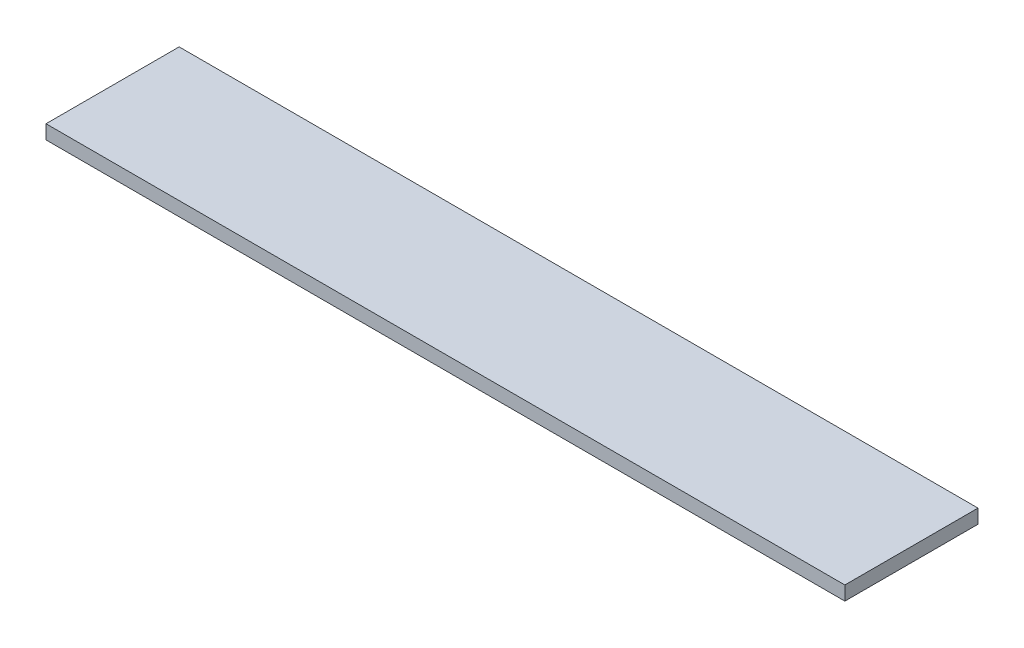
ISO-10303-21;
HEADER;
FILE_DESCRIPTION(('STEP AP214'),'2;1');
FILE_NAME('part.step','',(''),(''),'','','');
FILE_SCHEMA(('AUTOMOTIVE_DESIGN { 1 0 10303 214 1 1 1 1 }'));
ENDSEC;
DATA;
#1=APPLICATION_CONTEXT('core data for automotive mechanical design processes');
#2=APPLICATION_PROTOCOL_DEFINITION('international standard','automotive_design',2000,#1);
#3=PRODUCT_CONTEXT('',#1,'mechanical');
#4=PRODUCT('Part','Part','',(#3));
#5=PRODUCT_RELATED_PRODUCT_CATEGORY('part','',(#4));
#6=PRODUCT_DEFINITION_FORMATION('','',#4);
#7=PRODUCT_DEFINITION_CONTEXT('part definition',#1,'design');
#8=PRODUCT_DEFINITION('design','',#6,#7);
#9=PRODUCT_DEFINITION_SHAPE('','',#8);
#10=(LENGTH_UNIT() NAMED_UNIT(*) SI_UNIT(.MILLI.,.METRE.));
#11=(NAMED_UNIT(*) PLANE_ANGLE_UNIT() SI_UNIT($,.RADIAN.));
#12=(NAMED_UNIT(*) SI_UNIT($,.STERADIAN.) SOLID_ANGLE_UNIT());
#13=UNCERTAINTY_MEASURE_WITH_UNIT(LENGTH_MEASURE(1.E-05),#10,'distance_accuracy_value','');
#14=(GEOMETRIC_REPRESENTATION_CONTEXT(3) GLOBAL_UNCERTAINTY_ASSIGNED_CONTEXT((#13)) GLOBAL_UNIT_ASSIGNED_CONTEXT((#10,
#11,#12)) REPRESENTATION_CONTEXT('',''));
#15=CARTESIAN_POINT('',(0.,0.,0.));
#16=DIRECTION('',(0.,0.,1.));
#17=DIRECTION('',(1.,0.,0.));
#18=AXIS2_PLACEMENT_3D('',#15,#16,#17);
#19=CARTESIAN_POINT('',(-28.5,122.5,19.5));
#20=DIRECTION('',(-1.,0.,0.));
#21=DIRECTION('',(0.,0.,1.));
#22=AXIS2_PLACEMENT_3D('',#19,#20,#21);
#23=PLANE('',#22);
#24=DIRECTION('',(0.,0.,-1.));
#25=VECTOR('',#24,1.);
#26=CARTESIAN_POINT('',(-28.5,121.5,19.5));
#27=LINE('',#26,#25);
#28=CARTESIAN_POINT('',(-28.5,121.5,19.5));
#29=VERTEX_POINT('',#28);
#30=CARTESIAN_POINT('',(-28.5,121.5,9.99999999999986));
#31=VERTEX_POINT('',#30);
#32=EDGE_CURVE('E111',#29,#31,#27,.T.);
#33=ORIENTED_EDGE('',*,*,#32,.F.);
#34=DIRECTION('',(0.,-1.,0.));
#35=VECTOR('',#34,1.);
#36=CARTESIAN_POINT('',(-28.5,122.5,19.5));
#37=LINE('',#36,#35);
#38=CARTESIAN_POINT('',(-28.5,122.5,19.5));
#39=VERTEX_POINT('',#38);
#40=EDGE_CURVE('E11',#39,#29,#37,.T.);
#41=ORIENTED_EDGE('',*,*,#40,.F.);
#42=DIRECTION('',(0.,0.,-1.));
#43=VECTOR('',#42,1.);
#44=CARTESIAN_POINT('',(-28.5,122.5,19.5));
#45=LINE('',#44,#43);
#46=CARTESIAN_POINT('',(-28.5,122.5,9.99999999999986));
#47=VERTEX_POINT('',#46);
#48=EDGE_CURVE('E102',#39,#47,#45,.T.);
#49=ORIENTED_EDGE('',*,*,#48,.T.);
#50=DIRECTION('',(0.,-1.,0.));
#51=VECTOR('',#50,1.);
#52=CARTESIAN_POINT('',(-28.5,122.5,9.99999999999986));
#53=LINE('',#52,#51);
#54=EDGE_CURVE('E43',#47,#31,#53,.T.);
#55=ORIENTED_EDGE('',*,*,#54,.T.);
#56=EDGE_LOOP('',(#33,#41,#49,#55));
#57=FACE_BOUND('',#56,.T.);
#58=ADVANCED_FACE('F40',(#57),#23,.T.);
#59=CARTESIAN_POINT('',(-28.5,122.5,19.5));
#60=DIRECTION('',(0.,0.,1.));
#61=DIRECTION('',(1.,0.,0.));
#62=AXIS2_PLACEMENT_3D('',#59,#60,#61);
#63=PLANE('',#62);
#64=DIRECTION('',(-1.,0.,0.));
#65=VECTOR('',#64,1.);
#66=CARTESIAN_POINT('',(-28.5,121.5,19.5));
#67=LINE('',#66,#65);
#68=CARTESIAN_POINT('',(28.5,121.5,19.5));
#69=VERTEX_POINT('',#68);
#70=EDGE_CURVE('E106',#69,#29,#67,.T.);
#71=ORIENTED_EDGE('',*,*,#70,.F.);
#72=DIRECTION('',(0.,-1.,0.));
#73=VECTOR('',#72,1.);
#74=CARTESIAN_POINT('',(28.5,122.5,19.5));
#75=LINE('',#74,#73);
#76=CARTESIAN_POINT('',(28.5,122.5,19.5));
#77=VERTEX_POINT('',#76);
#78=EDGE_CURVE('E50',#77,#69,#75,.T.);
#79=ORIENTED_EDGE('',*,*,#78,.F.);
#80=DIRECTION('',(-1.,0.,0.));
#81=VECTOR('',#80,1.);
#82=CARTESIAN_POINT('',(-28.5,122.5,19.5));
#83=LINE('',#82,#81);
#84=EDGE_CURVE('E97',#77,#39,#83,.T.);
#85=ORIENTED_EDGE('',*,*,#84,.T.);
#86=ORIENTED_EDGE('',*,*,#40,.T.);
#87=EDGE_LOOP('',(#71,#79,#85,#86));
#88=FACE_BOUND('',#87,.T.);
#89=ADVANCED_FACE('F130',(#88),#63,.T.);
#90=CARTESIAN_POINT('',(28.5,122.5,19.5));
#91=DIRECTION('',(1.,0.,0.));
#92=DIRECTION('',(0.,0.,-1.));
#93=AXIS2_PLACEMENT_3D('',#90,#91,#92);
#94=PLANE('',#93);
#95=DIRECTION('',(0.,0.,1.));
#96=VECTOR('',#95,1.);
#97=CARTESIAN_POINT('',(28.5,121.5,19.5));
#98=LINE('',#97,#96);
#99=CARTESIAN_POINT('',(28.5,121.5,9.99999999999986));
#100=VERTEX_POINT('',#99);
#101=EDGE_CURVE('E91',#100,#69,#98,.T.);
#102=ORIENTED_EDGE('',*,*,#101,.F.);
#103=DIRECTION('',(0.,-1.,0.));
#104=VECTOR('',#103,1.);
#105=CARTESIAN_POINT('',(28.5,122.5,9.99999999999986));
#106=LINE('',#105,#104);
#107=CARTESIAN_POINT('',(28.5,122.5,9.99999999999986));
#108=VERTEX_POINT('',#107);
#109=EDGE_CURVE('E86',#108,#100,#106,.T.);
#110=ORIENTED_EDGE('',*,*,#109,.F.);
#111=DIRECTION('',(0.,0.,1.));
#112=VECTOR('',#111,1.);
#113=CARTESIAN_POINT('',(28.5,122.5,19.5));
#114=LINE('',#113,#112);
#115=EDGE_CURVE('E89',#108,#77,#114,.T.);
#116=ORIENTED_EDGE('',*,*,#115,.T.);
#117=ORIENTED_EDGE('',*,*,#78,.T.);
#118=EDGE_LOOP('',(#102,#110,#116,#117));
#119=FACE_BOUND('',#118,.T.);
#120=ADVANCED_FACE('F88',(#119),#94,.T.);
#121=CARTESIAN_POINT('',(-28.5,122.5,9.99999999999986));
#122=DIRECTION('',(0.,0.,-1.));
#123=DIRECTION('',(-1.,0.,0.));
#124=AXIS2_PLACEMENT_3D('',#121,#122,#123);
#125=PLANE('',#124);
#126=DIRECTION('',(1.,0.,0.));
#127=VECTOR('',#126,1.);
#128=CARTESIAN_POINT('',(-28.5,121.5,9.99999999999986));
#129=LINE('',#128,#127);
#130=EDGE_CURVE('E115',#31,#100,#129,.T.);
#131=ORIENTED_EDGE('',*,*,#130,.F.);
#132=ORIENTED_EDGE('',*,*,#54,.F.);
#133=DIRECTION('',(1.,0.,0.));
#134=VECTOR('',#133,1.);
#135=CARTESIAN_POINT('',(-28.5,122.5,9.99999999999986));
#136=LINE('',#135,#134);
#137=EDGE_CURVE('E96',#47,#108,#136,.T.);
#138=ORIENTED_EDGE('',*,*,#137,.T.);
#139=ORIENTED_EDGE('',*,*,#109,.T.);
#140=EDGE_LOOP('',(#131,#132,#138,#139));
#141=FACE_BOUND('',#140,.T.);
#142=ADVANCED_FACE('F100',(#141),#125,.T.);
#143=CARTESIAN_POINT('',(0.,122.5,0.));
#144=DIRECTION('',(0.,-1.,0.));
#145=DIRECTION('',(0.,0.,-1.));
#146=AXIS2_PLACEMENT_3D('',#143,#144,#145);
#147=PLANE('',#146);
#148=ORIENTED_EDGE('',*,*,#48,.F.);
#149=ORIENTED_EDGE('',*,*,#84,.F.);
#150=ORIENTED_EDGE('',*,*,#115,.F.);
#151=ORIENTED_EDGE('',*,*,#137,.F.);
#152=EDGE_LOOP('',(#148,#149,#150,#151));
#153=FACE_BOUND('',#152,.T.);
#154=ADVANCED_FACE('F95',(#153),#147,.F.);
#155=CARTESIAN_POINT('',(0.,121.5,0.));
#156=DIRECTION('',(0.,-1.,0.));
#157=DIRECTION('',(0.,0.,-1.));
#158=AXIS2_PLACEMENT_3D('',#155,#156,#157);
#159=PLANE('',#158);
#160=ORIENTED_EDGE('',*,*,#32,.T.);
#161=ORIENTED_EDGE('',*,*,#130,.T.);
#162=ORIENTED_EDGE('',*,*,#101,.T.);
#163=ORIENTED_EDGE('',*,*,#70,.T.);
#164=EDGE_LOOP('',(#160,#161,#162,#163));
#165=FACE_BOUND('',#164,.T.);
#166=ADVANCED_FACE('F129',(#165),#159,.T.);
#167=CLOSED_SHELL('',(#58,#89,#120,#142,#154,#166));
#168=MANIFOLD_SOLID_BREP('B2',#167);
#169=ADVANCED_BREP_SHAPE_REPRESENTATION('',(#18,#168),#14);
#170=SHAPE_DEFINITION_REPRESENTATION(#9,#169);
ENDSEC;
END-ISO-10303-21;
